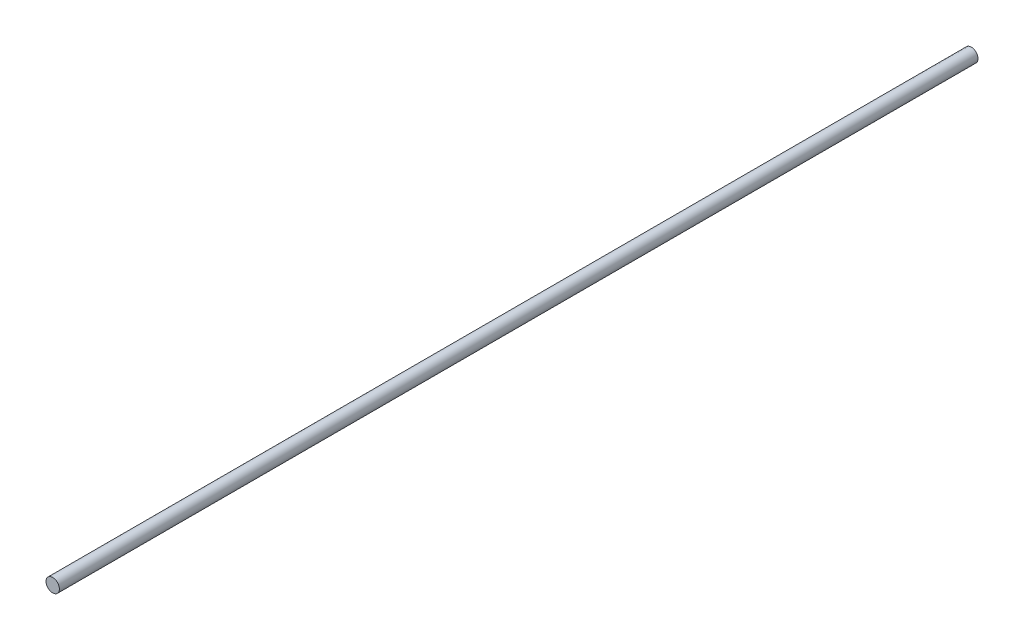
ISO-10303-21;
HEADER;
FILE_DESCRIPTION(('STEP AP214'),'2;1');
FILE_NAME('part.step','',(''),(''),'','','');
FILE_SCHEMA(('AUTOMOTIVE_DESIGN { 1 0 10303 214 1 1 1 1 }'));
ENDSEC;
DATA;
#1=APPLICATION_CONTEXT('core data for automotive mechanical design processes');
#2=APPLICATION_PROTOCOL_DEFINITION('international standard','automotive_design',2000,#1);
#3=PRODUCT_CONTEXT('',#1,'mechanical');
#4=PRODUCT('Part','Part','',(#3));
#5=PRODUCT_RELATED_PRODUCT_CATEGORY('part','',(#4));
#6=PRODUCT_DEFINITION_FORMATION('','',#4);
#7=PRODUCT_DEFINITION_CONTEXT('part definition',#1,'design');
#8=PRODUCT_DEFINITION('design','',#6,#7);
#9=PRODUCT_DEFINITION_SHAPE('','',#8);
#10=(LENGTH_UNIT() NAMED_UNIT(*) SI_UNIT(.MILLI.,.METRE.));
#11=(NAMED_UNIT(*) PLANE_ANGLE_UNIT() SI_UNIT($,.RADIAN.));
#12=(NAMED_UNIT(*) SI_UNIT($,.STERADIAN.) SOLID_ANGLE_UNIT());
#13=UNCERTAINTY_MEASURE_WITH_UNIT(LENGTH_MEASURE(1.E-05),#10,'distance_accuracy_value','');
#14=(GEOMETRIC_REPRESENTATION_CONTEXT(3) GLOBAL_UNCERTAINTY_ASSIGNED_CONTEXT((#13)) GLOBAL_UNIT_ASSIGNED_CONTEXT((#10,
#11,#12)) REPRESENTATION_CONTEXT('',''));
#15=CARTESIAN_POINT('',(0.,0.,0.));
#16=DIRECTION('',(0.,0.,1.));
#17=DIRECTION('',(1.,0.,0.));
#18=AXIS2_PLACEMENT_3D('',#15,#16,#17);
#19=CARTESIAN_POINT('',(2.02441659747244,-11.4289051038553,206.));
#20=DIRECTION('',(0.,0.,-1.));
#21=DIRECTION('',(-1.,0.,0.));
#22=AXIS2_PLACEMENT_3D('',#19,#20,#21);
#23=CYLINDRICAL_SURFACE('',#22,1.5);
#24=CARTESIAN_POINT('',(2.02441659747244,-11.4289051038553,206.));
#25=DIRECTION('',(0.,0.,1.));
#26=DIRECTION('',(1.,0.,0.));
#27=AXIS2_PLACEMENT_3D('',#24,#25,#26);
#28=CIRCLE('',#27,1.5);
#29=CARTESIAN_POINT('',(3.52441659747244,-11.4289051038553,206.));
#30=VERTEX_POINT('',#29);
#31=EDGE_CURVE('E10',#30,#30,#28,.T.);
#32=ORIENTED_EDGE('',*,*,#31,.F.);
#33=EDGE_LOOP('',(#32));
#34=FACE_BOUND('',#33,.T.);
#35=CARTESIAN_POINT('',(2.02441659747244,-11.4289051038553,0.));
#36=DIRECTION('',(0.,0.,1.));
#37=DIRECTION('',(1.,0.,0.));
#38=AXIS2_PLACEMENT_3D('',#35,#36,#37);
#39=CIRCLE('',#38,1.5);
#40=CARTESIAN_POINT('',(3.52441659747244,-11.4289051038553,0.));
#41=VERTEX_POINT('',#40);
#42=EDGE_CURVE('E38',#41,#41,#39,.T.);
#43=ORIENTED_EDGE('',*,*,#42,.T.);
#44=EDGE_LOOP('',(#43));
#45=FACE_BOUND('',#44,.T.);
#46=ADVANCED_FACE('F35',(#34,#45),#23,.T.);
#47=CARTESIAN_POINT('',(2.02441659747244,-11.4289051038553,206.));
#48=DIRECTION('',(0.,0.,1.));
#49=DIRECTION('',(1.,0.,0.));
#50=AXIS2_PLACEMENT_3D('',#47,#48,#49);
#51=PLANE('',#50);
#52=ORIENTED_EDGE('',*,*,#31,.T.);
#53=EDGE_LOOP('',(#52));
#54=FACE_BOUND('',#53,.T.);
#55=ADVANCED_FACE('F50',(#54),#51,.T.);
#56=CARTESIAN_POINT('',(2.02441659747244,-11.4289051038553,0.));
#57=DIRECTION('',(0.,0.,1.));
#58=DIRECTION('',(1.,0.,0.));
#59=AXIS2_PLACEMENT_3D('',#56,#57,#58);
#60=PLANE('',#59);
#61=ORIENTED_EDGE('',*,*,#42,.F.);
#62=EDGE_LOOP('',(#61));
#63=FACE_BOUND('',#62,.T.);
#64=ADVANCED_FACE('F48',(#63),#60,.F.);
#65=CLOSED_SHELL('',(#46,#55,#64));
#66=MANIFOLD_SOLID_BREP('B2',#65);
#67=ADVANCED_BREP_SHAPE_REPRESENTATION('',(#18,#66),#14);
#68=SHAPE_DEFINITION_REPRESENTATION(#9,#67);
ENDSEC;
END-ISO-10303-21;
